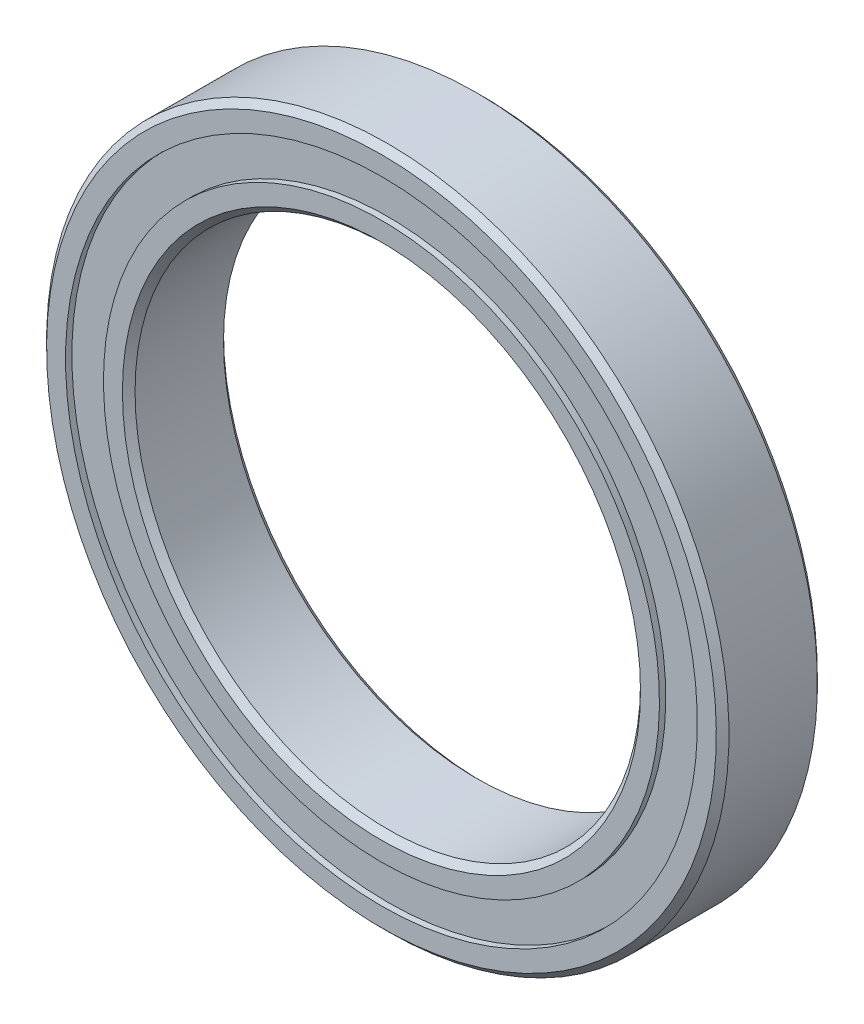
ISO-10303-21;
HEADER;
FILE_DESCRIPTION(('STEP AP214'),'2;1');
FILE_NAME('part.step','',(''),(''),'','','');
FILE_SCHEMA(('AUTOMOTIVE_DESIGN { 1 0 10303 214 1 1 1 1 }'));
ENDSEC;
DATA;
#1=APPLICATION_CONTEXT('core data for automotive mechanical design processes');
#2=APPLICATION_PROTOCOL_DEFINITION('international standard','automotive_design',2000,#1);
#3=PRODUCT_CONTEXT('',#1,'mechanical');
#4=PRODUCT('Part','Part','',(#3));
#5=PRODUCT_RELATED_PRODUCT_CATEGORY('part','',(#4));
#6=PRODUCT_DEFINITION_FORMATION('','',#4);
#7=PRODUCT_DEFINITION_CONTEXT('part definition',#1,'design');
#8=PRODUCT_DEFINITION('design','',#6,#7);
#9=PRODUCT_DEFINITION_SHAPE('','',#8);
#10=(LENGTH_UNIT() NAMED_UNIT(*) SI_UNIT(.MILLI.,.METRE.));
#11=(NAMED_UNIT(*) PLANE_ANGLE_UNIT() SI_UNIT($,.RADIAN.));
#12=(NAMED_UNIT(*) SI_UNIT($,.STERADIAN.) SOLID_ANGLE_UNIT());
#13=UNCERTAINTY_MEASURE_WITH_UNIT(LENGTH_MEASURE(1.E-05),#10,'distance_accuracy_value','');
#14=(GEOMETRIC_REPRESENTATION_CONTEXT(3) GLOBAL_UNCERTAINTY_ASSIGNED_CONTEXT((#13)) GLOBAL_UNIT_ASSIGNED_CONTEXT((#10,
#11,#12)) REPRESENTATION_CONTEXT('',''));
#15=CARTESIAN_POINT('',(0.,0.,0.));
#16=DIRECTION('',(0.,0.,1.));
#17=DIRECTION('',(1.,0.,0.));
#18=AXIS2_PLACEMENT_3D('',#15,#16,#17);
#19=CARTESIAN_POINT('',(0.,0.,2.));
#20=DIRECTION('',(0.,0.,-1.));
#21=DIRECTION('',(0.,1.,0.));
#22=AXIS2_PLACEMENT_3D('',#19,#20,#21);
#23=CYLINDRICAL_SURFACE('',#22,10.0000000000001);
#24=CARTESIAN_POINT('',(0.,0.,-1.74999999999995));
#25=DIRECTION('',(0.,0.,-1.));
#26=DIRECTION('',(-1.,0.,0.));
#27=AXIS2_PLACEMENT_3D('',#24,#25,#26);
#28=CIRCLE('',#27,10.);
#29=CARTESIAN_POINT('',(-10.,0.,-1.74999999999995));
#30=VERTEX_POINT('',#29);
#31=EDGE_CURVE('E30',#30,#30,#28,.T.);
#32=ORIENTED_EDGE('',*,*,#31,.T.);
#33=EDGE_LOOP('',(#32));
#34=FACE_BOUND('',#33,.T.);
#35=CARTESIAN_POINT('',(0.,0.,1.74999999999995));
#36=DIRECTION('',(0.,0.,1.));
#37=DIRECTION('',(1.,0.,0.));
#38=AXIS2_PLACEMENT_3D('',#35,#36,#37);
#39=CIRCLE('',#38,10.);
#40=CARTESIAN_POINT('',(10.,0.,1.74999999999995));
#41=VERTEX_POINT('',#40);
#42=EDGE_CURVE('E33',#41,#41,#39,.T.);
#43=ORIENTED_EDGE('',*,*,#42,.T.);
#44=EDGE_LOOP('',(#43));
#45=FACE_BOUND('',#44,.T.);
#46=ADVANCED_FACE('F15',(#34,#45),#23,.F.);
#47=CARTESIAN_POINT('',(0.,0.,2.));
#48=DIRECTION('',(0.,0.,1.));
#49=DIRECTION('',(1.,0.,0.));
#50=AXIS2_PLACEMENT_3D('',#47,#48,#49);
#51=CONICAL_SURFACE('',#50,10.2500000000001,0.785398163397456);
#52=ORIENTED_EDGE('',*,*,#42,.F.);
#53=EDGE_LOOP('',(#52));
#54=FACE_BOUND('',#53,.T.);
#55=CARTESIAN_POINT('',(0.,0.,2.));
#56=DIRECTION('',(0.,0.,1.));
#57=DIRECTION('',(1.,0.,0.));
#58=AXIS2_PLACEMENT_3D('',#55,#56,#57);
#59=CIRCLE('',#58,10.2500000000001);
#60=CARTESIAN_POINT('',(10.2500000000001,0.,2.));
#61=VERTEX_POINT('',#60);
#62=EDGE_CURVE('E18',#61,#61,#59,.F.);
#63=ORIENTED_EDGE('',*,*,#62,.F.);
#64=EDGE_LOOP('',(#63));
#65=FACE_BOUND('',#64,.T.);
#66=ADVANCED_FACE('F73',(#54,#65),#51,.F.);
#67=CARTESIAN_POINT('',(0.,0.,-2.));
#68=DIRECTION('',(0.,0.,-1.));
#69=DIRECTION('',(-1.,0.,0.));
#70=AXIS2_PLACEMENT_3D('',#67,#68,#69);
#71=CONICAL_SURFACE('',#70,10.2500000000001,0.785398163397442);
#72=CARTESIAN_POINT('',(0.,0.,-2.));
#73=DIRECTION('',(0.,0.,-1.));
#74=DIRECTION('',(-1.,0.,0.));
#75=AXIS2_PLACEMENT_3D('',#72,#73,#74);
#76=CIRCLE('',#75,10.2500000000001);
#77=CARTESIAN_POINT('',(-10.2500000000001,0.,-2.));
#78=VERTEX_POINT('',#77);
#79=EDGE_CURVE('E64',#78,#78,#76,.T.);
#80=ORIENTED_EDGE('',*,*,#79,.T.);
#81=EDGE_LOOP('',(#80));
#82=FACE_BOUND('',#81,.T.);
#83=ORIENTED_EDGE('',*,*,#31,.F.);
#84=EDGE_LOOP('',(#83));
#85=FACE_BOUND('',#84,.T.);
#86=ADVANCED_FACE('F75',(#82,#85),#71,.F.);
#87=CARTESIAN_POINT('',(0.,0.,2.));
#88=DIRECTION('',(0.,0.,1.));
#89=DIRECTION('',(0.,-1.,0.));
#90=AXIS2_PLACEMENT_3D('',#87,#88,#89);
#91=PLANE('',#90);
#92=CARTESIAN_POINT('',(0.,0.,2.));
#93=DIRECTION('',(0.,0.,1.));
#94=DIRECTION('',(0.,-1.,0.));
#95=AXIS2_PLACEMENT_3D('',#92,#93,#94);
#96=CIRCLE('',#95,11.0000000000001);
#97=CARTESIAN_POINT('',(0.,-11.0000000000001,2.));
#98=VERTEX_POINT('',#97);
#99=EDGE_CURVE('E62',#98,#98,#96,.F.);
#100=ORIENTED_EDGE('',*,*,#99,.F.);
#101=EDGE_LOOP('',(#100));
#102=FACE_BOUND('',#101,.T.);
#103=ORIENTED_EDGE('',*,*,#62,.T.);
#104=EDGE_LOOP('',(#103));
#105=FACE_BOUND('',#104,.T.);
#106=ADVANCED_FACE('F71',(#102,#105),#91,.T.);
#107=CARTESIAN_POINT('',(0.,0.,-2.));
#108=DIRECTION('',(0.,0.,1.));
#109=DIRECTION('',(0.,-1.,0.));
#110=AXIS2_PLACEMENT_3D('',#107,#108,#109);
#111=PLANE('',#110);
#112=CARTESIAN_POINT('',(0.,0.,-2.));
#113=DIRECTION('',(0.,0.,-1.));
#114=DIRECTION('',(0.,1.,0.));
#115=AXIS2_PLACEMENT_3D('',#112,#113,#114);
#116=CIRCLE('',#115,11.0000000000001);
#117=CARTESIAN_POINT('',(0.,11.0000000000001,-2.));
#118=VERTEX_POINT('',#117);
#119=EDGE_CURVE('E59',#118,#118,#116,.F.);
#120=ORIENTED_EDGE('',*,*,#119,.F.);
#121=EDGE_LOOP('',(#120));
#122=FACE_BOUND('',#121,.T.);
#123=ORIENTED_EDGE('',*,*,#79,.F.);
#124=EDGE_LOOP('',(#123));
#125=FACE_BOUND('',#124,.T.);
#126=ADVANCED_FACE('F131',(#122,#125),#111,.F.);
#127=CARTESIAN_POINT('',(0.,0.,1.75));
#128=DIRECTION('',(0.,0.,1.));
#129=DIRECTION('',(0.,-1.,0.));
#130=AXIS2_PLACEMENT_3D('',#127,#128,#129);
#131=CYLINDRICAL_SURFACE('',#130,11.0000000000001);
#132=CARTESIAN_POINT('',(0.,0.,1.75));
#133=DIRECTION('',(0.,0.,1.));
#134=DIRECTION('',(0.,-1.,0.));
#135=AXIS2_PLACEMENT_3D('',#132,#133,#134);
#136=CIRCLE('',#135,11.0000000000001);
#137=CARTESIAN_POINT('',(0.,-11.0000000000001,1.75));
#138=VERTEX_POINT('',#137);
#139=EDGE_CURVE('E56',#138,#138,#136,.F.);
#140=ORIENTED_EDGE('',*,*,#139,.F.);
#141=EDGE_LOOP('',(#140));
#142=FACE_BOUND('',#141,.T.);
#143=ORIENTED_EDGE('',*,*,#99,.T.);
#144=EDGE_LOOP('',(#143));
#145=FACE_BOUND('',#144,.T.);
#146=ADVANCED_FACE('F127',(#142,#145),#131,.T.);
#147=CARTESIAN_POINT('',(0.,0.,-1.75));
#148=DIRECTION('',(0.,0.,-1.));
#149=DIRECTION('',(0.,1.,0.));
#150=AXIS2_PLACEMENT_3D('',#147,#148,#149);
#151=CYLINDRICAL_SURFACE('',#150,11.0000000000001);
#152=ORIENTED_EDGE('',*,*,#119,.T.);
#153=EDGE_LOOP('',(#152));
#154=FACE_BOUND('',#153,.T.);
#155=CARTESIAN_POINT('',(0.,0.,-1.75));
#156=DIRECTION('',(0.,0.,-1.));
#157=DIRECTION('',(0.,1.,0.));
#158=AXIS2_PLACEMENT_3D('',#155,#156,#157);
#159=CIRCLE('',#158,11.0000000000001);
#160=CARTESIAN_POINT('',(0.,11.0000000000001,-1.75));
#161=VERTEX_POINT('',#160);
#162=EDGE_CURVE('E53',#161,#161,#159,.F.);
#163=ORIENTED_EDGE('',*,*,#162,.F.);
#164=EDGE_LOOP('',(#163));
#165=FACE_BOUND('',#164,.T.);
#166=ADVANCED_FACE('F123',(#154,#165),#151,.T.);
#167=CARTESIAN_POINT('',(0.,0.,1.75));
#168=DIRECTION('',(0.,0.,1.));
#169=DIRECTION('',(0.,-1.,0.));
#170=AXIS2_PLACEMENT_3D('',#167,#168,#169);
#171=PLANE('',#170);
#172=CARTESIAN_POINT('',(0.,0.,1.75));
#173=DIRECTION('',(0.,0.,1.));
#174=DIRECTION('',(0.,-1.,0.));
#175=AXIS2_PLACEMENT_3D('',#172,#173,#174);
#176=CIRCLE('',#175,12.5000000000001);
#177=CARTESIAN_POINT('',(0.,-12.5000000000001,1.75));
#178=VERTEX_POINT('',#177);
#179=EDGE_CURVE('E50',#178,#178,#176,.T.);
#180=ORIENTED_EDGE('',*,*,#179,.T.);
#181=EDGE_LOOP('',(#180));
#182=FACE_BOUND('',#181,.T.);
#183=ORIENTED_EDGE('',*,*,#139,.T.);
#184=EDGE_LOOP('',(#183));
#185=FACE_BOUND('',#184,.T.);
#186=ADVANCED_FACE('F119',(#182,#185),#171,.T.);
#187=CARTESIAN_POINT('',(0.,0.,-1.75));
#188=DIRECTION('',(0.,0.,-1.));
#189=DIRECTION('',(0.,1.,0.));
#190=AXIS2_PLACEMENT_3D('',#187,#188,#189);
#191=PLANE('',#190);
#192=ORIENTED_EDGE('',*,*,#162,.T.);
#193=EDGE_LOOP('',(#192));
#194=FACE_BOUND('',#193,.T.);
#195=CARTESIAN_POINT('',(0.,0.,-1.75));
#196=DIRECTION('',(0.,0.,-1.));
#197=DIRECTION('',(0.,1.,0.));
#198=AXIS2_PLACEMENT_3D('',#195,#196,#197);
#199=CIRCLE('',#198,12.5000000000001);
#200=CARTESIAN_POINT('',(0.,12.5000000000001,-1.75));
#201=VERTEX_POINT('',#200);
#202=EDGE_CURVE('E47',#201,#201,#199,.T.);
#203=ORIENTED_EDGE('',*,*,#202,.T.);
#204=EDGE_LOOP('',(#203));
#205=FACE_BOUND('',#204,.T.);
#206=ADVANCED_FACE('F115',(#194,#205),#191,.T.);
#207=CARTESIAN_POINT('',(0.,0.,1.75));
#208=DIRECTION('',(0.,0.,1.));
#209=DIRECTION('',(0.,-1.,0.));
#210=AXIS2_PLACEMENT_3D('',#207,#208,#209);
#211=CYLINDRICAL_SURFACE('',#210,12.5000000000001);
#212=CARTESIAN_POINT('',(0.,0.,2.));
#213=DIRECTION('',(0.,0.,1.));
#214=DIRECTION('',(0.,-1.,0.));
#215=AXIS2_PLACEMENT_3D('',#212,#213,#214);
#216=CIRCLE('',#215,12.5000000000001);
#217=CARTESIAN_POINT('',(0.,-12.5000000000001,2.));
#218=VERTEX_POINT('',#217);
#219=EDGE_CURVE('E44',#218,#218,#216,.F.);
#220=ORIENTED_EDGE('',*,*,#219,.F.);
#221=EDGE_LOOP('',(#220));
#222=FACE_BOUND('',#221,.T.);
#223=ORIENTED_EDGE('',*,*,#179,.F.);
#224=EDGE_LOOP('',(#223));
#225=FACE_BOUND('',#224,.T.);
#226=ADVANCED_FACE('F111',(#222,#225),#211,.F.);
#227=CARTESIAN_POINT('',(0.,0.,-1.75));
#228=DIRECTION('',(0.,0.,-1.));
#229=DIRECTION('',(0.,1.,0.));
#230=AXIS2_PLACEMENT_3D('',#227,#228,#229);
#231=CYLINDRICAL_SURFACE('',#230,12.5000000000001);
#232=CARTESIAN_POINT('',(0.,0.,-2.));
#233=DIRECTION('',(0.,0.,-1.));
#234=DIRECTION('',(0.,1.,0.));
#235=AXIS2_PLACEMENT_3D('',#232,#233,#234);
#236=CIRCLE('',#235,12.5000000000001);
#237=CARTESIAN_POINT('',(0.,12.5000000000001,-2.));
#238=VERTEX_POINT('',#237);
#239=EDGE_CURVE('E41',#238,#238,#236,.T.);
#240=ORIENTED_EDGE('',*,*,#239,.T.);
#241=EDGE_LOOP('',(#240));
#242=FACE_BOUND('',#241,.T.);
#243=ORIENTED_EDGE('',*,*,#202,.F.);
#244=EDGE_LOOP('',(#243));
#245=FACE_BOUND('',#244,.T.);
#246=ADVANCED_FACE('F107',(#242,#245),#231,.F.);
#247=CARTESIAN_POINT('',(0.,0.,2.));
#248=DIRECTION('',(0.,0.,1.));
#249=DIRECTION('',(0.,-1.,0.));
#250=AXIS2_PLACEMENT_3D('',#247,#248,#249);
#251=PLANE('',#250);
#252=ORIENTED_EDGE('',*,*,#219,.T.);
#253=EDGE_LOOP('',(#252));
#254=FACE_BOUND('',#253,.T.);
#255=CARTESIAN_POINT('',(0.,0.,2.00000000000007));
#256=DIRECTION('',(0.,0.,-1.));
#257=DIRECTION('',(0.,1.,0.));
#258=AXIS2_PLACEMENT_3D('',#255,#256,#257);
#259=CIRCLE('',#258,13.2500000000001);
#260=CARTESIAN_POINT('',(0.,13.2500000000001,2.00000000000007));
#261=VERTEX_POINT('',#260);
#262=EDGE_CURVE('E38',#261,#261,#259,.T.);
#263=ORIENTED_EDGE('',*,*,#262,.F.);
#264=EDGE_LOOP('',(#263));
#265=FACE_BOUND('',#264,.T.);
#266=ADVANCED_FACE('F103',(#254,#265),#251,.T.);
#267=CARTESIAN_POINT('',(0.,0.,-2.));
#268=DIRECTION('',(0.,0.,1.));
#269=DIRECTION('',(0.,-1.,0.));
#270=AXIS2_PLACEMENT_3D('',#267,#268,#269);
#271=PLANE('',#270);
#272=ORIENTED_EDGE('',*,*,#239,.F.);
#273=EDGE_LOOP('',(#272));
#274=FACE_BOUND('',#273,.T.);
#275=CARTESIAN_POINT('',(0.,0.,-2.00000000000004));
#276=DIRECTION('',(0.,0.,1.));
#277=DIRECTION('',(0.,-1.,0.));
#278=AXIS2_PLACEMENT_3D('',#275,#276,#277);
#279=CIRCLE('',#278,13.2500000000001);
#280=CARTESIAN_POINT('',(0.,-13.2500000000001,-2.00000000000004));
#281=VERTEX_POINT('',#280);
#282=EDGE_CURVE('E27',#281,#281,#279,.T.);
#283=ORIENTED_EDGE('',*,*,#282,.F.);
#284=EDGE_LOOP('',(#283));
#285=FACE_BOUND('',#284,.T.);
#286=ADVANCED_FACE('F99',(#274,#285),#271,.F.);
#287=CARTESIAN_POINT('',(0.,0.,1.75000000000007));
#288=DIRECTION('',(0.,0.,-1.));
#289=DIRECTION('',(0.,1.,0.));
#290=AXIS2_PLACEMENT_3D('',#287,#288,#289);
#291=CONICAL_SURFACE('',#290,13.5000000000001,0.785398163397434);
#292=CARTESIAN_POINT('',(0.,0.,1.75));
#293=DIRECTION('',(0.,0.,-1.));
#294=DIRECTION('',(0.,1.,0.));
#295=AXIS2_PLACEMENT_3D('',#292,#293,#294);
#296=CIRCLE('',#295,13.5000000000001);
#297=CARTESIAN_POINT('',(0.,13.5000000000001,1.75));
#298=VERTEX_POINT('',#297);
#299=EDGE_CURVE('E22',#298,#298,#296,.T.);
#300=ORIENTED_EDGE('',*,*,#299,.F.);
#301=EDGE_LOOP('',(#300));
#302=FACE_BOUND('',#301,.T.);
#303=ORIENTED_EDGE('',*,*,#262,.T.);
#304=EDGE_LOOP('',(#303));
#305=FACE_BOUND('',#304,.T.);
#306=ADVANCED_FACE('F92',(#302,#305),#291,.T.);
#307=CARTESIAN_POINT('',(0.,0.,-1.75000000000007));
#308=DIRECTION('',(0.,0.,1.));
#309=DIRECTION('',(0.,-1.,0.));
#310=AXIS2_PLACEMENT_3D('',#307,#308,#309);
#311=CONICAL_SURFACE('',#310,13.5000000000001,0.78539816339745);
#312=CARTESIAN_POINT('',(0.,0.,-1.75));
#313=DIRECTION('',(0.,0.,-1.));
#314=DIRECTION('',(0.,1.,0.));
#315=AXIS2_PLACEMENT_3D('',#312,#313,#314);
#316=CIRCLE('',#315,13.5000000000001);
#317=CARTESIAN_POINT('',(0.,13.5000000000001,-1.75));
#318=VERTEX_POINT('',#317);
#319=EDGE_CURVE('E10',#318,#318,#316,.F.);
#320=ORIENTED_EDGE('',*,*,#319,.F.);
#321=EDGE_LOOP('',(#320));
#322=FACE_BOUND('',#321,.T.);
#323=ORIENTED_EDGE('',*,*,#282,.T.);
#324=EDGE_LOOP('',(#323));
#325=FACE_BOUND('',#324,.T.);
#326=ADVANCED_FACE('F87',(#322,#325),#311,.T.);
#327=CARTESIAN_POINT('',(0.,0.,2.));
#328=DIRECTION('',(0.,0.,-1.));
#329=DIRECTION('',(0.,1.,0.));
#330=AXIS2_PLACEMENT_3D('',#327,#328,#329);
#331=CYLINDRICAL_SURFACE('',#330,13.5000000000001);
#332=ORIENTED_EDGE('',*,*,#319,.T.);
#333=EDGE_LOOP('',(#332));
#334=FACE_BOUND('',#333,.T.);
#335=ORIENTED_EDGE('',*,*,#299,.T.);
#336=EDGE_LOOP('',(#335));
#337=FACE_BOUND('',#336,.T.);
#338=ADVANCED_FACE('F85',(#334,#337),#331,.T.);
#339=CLOSED_SHELL('',(#46,#66,#86,#106,#126,#146,#166,#186,#206,#226,#246,#266,#286,#306,#326,#338));
#340=MANIFOLD_SOLID_BREP('B1',#339);
#341=ADVANCED_BREP_SHAPE_REPRESENTATION('',(#18,#340),#14);
#342=SHAPE_DEFINITION_REPRESENTATION(#9,#341);
ENDSEC;
END-ISO-10303-21;
